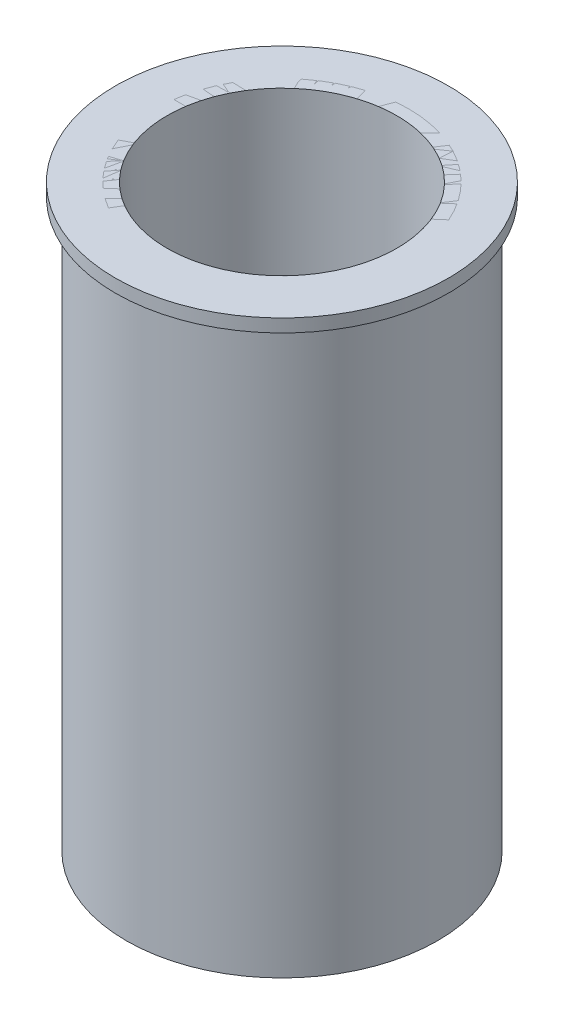
ISO-10303-21;
HEADER;
FILE_DESCRIPTION(('STEP AP214'),'2;1');
FILE_NAME('part.step','',(''),(''),'','','');
FILE_SCHEMA(('AUTOMOTIVE_DESIGN { 1 0 10303 214 1 1 1 1 }'));
ENDSEC;
DATA;
#1=APPLICATION_CONTEXT('core data for automotive mechanical design processes');
#2=APPLICATION_PROTOCOL_DEFINITION('international standard','automotive_design',2000,#1);
#3=PRODUCT_CONTEXT('',#1,'mechanical');
#4=PRODUCT('Part','Part','',(#3));
#5=PRODUCT_RELATED_PRODUCT_CATEGORY('part','',(#4));
#6=PRODUCT_DEFINITION_FORMATION('','',#4);
#7=PRODUCT_DEFINITION_CONTEXT('part definition',#1,'design');
#8=PRODUCT_DEFINITION('design','',#6,#7);
#9=PRODUCT_DEFINITION_SHAPE('','',#8);
#10=(LENGTH_UNIT() NAMED_UNIT(*) SI_UNIT(.MILLI.,.METRE.));
#11=(NAMED_UNIT(*) PLANE_ANGLE_UNIT() SI_UNIT($,.RADIAN.));
#12=(NAMED_UNIT(*) SI_UNIT($,.STERADIAN.) SOLID_ANGLE_UNIT());
#13=UNCERTAINTY_MEASURE_WITH_UNIT(LENGTH_MEASURE(1.E-05),#10,'distance_accuracy_value','');
#14=(GEOMETRIC_REPRESENTATION_CONTEXT(3) GLOBAL_UNCERTAINTY_ASSIGNED_CONTEXT((#13)) GLOBAL_UNIT_ASSIGNED_CONTEXT((#10,
#11,#12)) REPRESENTATION_CONTEXT('',''));
#15=CARTESIAN_POINT('',(0.,0.,0.));
#16=DIRECTION('',(0.,0.,1.));
#17=DIRECTION('',(1.,0.,0.));
#18=AXIS2_PLACEMENT_3D('',#15,#16,#17);
#19=CARTESIAN_POINT('',(0.,-15.64,0.));
#20=DIRECTION('',(0.,-1.,0.));
#21=DIRECTION('',(0.,0.,-1.));
#22=AXIS2_PLACEMENT_3D('',#19,#20,#21);
#23=CYLINDRICAL_SURFACE('',#22,3.5);
#24=CARTESIAN_POINT('',(0.,0.359999999999999,0.));
#25=DIRECTION('',(0.,-1.,0.));
#26=DIRECTION('',(0.,0.,-1.));
#27=AXIS2_PLACEMENT_3D('',#24,#25,#26);
#28=CIRCLE('',#27,3.5);
#29=CARTESIAN_POINT('',(0.,0.359999999999999,-3.5));
#30=VERTEX_POINT('',#29);
#31=EDGE_CURVE('P0_E21',#30,#30,#28,.T.);
#32=ORIENTED_EDGE('',*,*,#31,.T.);
#33=EDGE_LOOP('',(#32));
#34=FACE_BOUND('',#33,.T.);
#35=CARTESIAN_POINT('',(0.,-15.64,0.));
#36=DIRECTION('',(0.,-1.,0.));
#37=DIRECTION('',(0.,0.,-1.));
#38=AXIS2_PLACEMENT_3D('',#35,#36,#37);
#39=CIRCLE('',#38,3.5);
#40=CARTESIAN_POINT('',(0.,-15.64,-3.5));
#41=VERTEX_POINT('',#40);
#42=EDGE_CURVE('P0_E11',#41,#41,#39,.F.);
#43=ORIENTED_EDGE('',*,*,#42,.T.);
#44=EDGE_LOOP('',(#43));
#45=FACE_BOUND('',#44,.T.);
#46=ADVANCED_FACE('P0_F17',(#34,#45),#23,.T.);
#47=CARTESIAN_POINT('',(0.,0.36,0.));
#48=DIRECTION('',(0.,-1.,0.));
#49=DIRECTION('',(0.,0.,-1.));
#50=AXIS2_PLACEMENT_3D('',#47,#48,#49);
#51=PLANE('',#50);
#52=CARTESIAN_POINT('',(-3.175,0.36,0.));
#53=CARTESIAN_POINT('',(-3.17479759041719,0.36,0.605854694368675));
#54=CARTESIAN_POINT('',(-2.95207785587322,0.36,1.16870070285895));
#55=CARTESIAN_POINT('',(-2.71032567563412,0.36,1.77964454207466));
#56=CARTESIAN_POINT('',(-2.24506403026729,0.36,2.24506403026729));
#57=CARTESIAN_POINT('',(-1.78054744880429,0.36,2.70973820178865));
#58=CARTESIAN_POINT('',(-1.16870070285895,0.36,2.95207785587322));
#59=CARTESIAN_POINT('',(-0.606133925916415,0.36,3.17489874856764));
#60=CARTESIAN_POINT('',(0.,0.36,3.175));
#61=CARTESIAN_POINT('',(0.605087739308986,0.36,3.17510107667248));
#62=CARTESIAN_POINT('',(1.16870070285895,0.36,2.95207785587322));
#63=CARTESIAN_POINT('',(1.77964454207504,0.36,2.71032567563373));
#64=CARTESIAN_POINT('',(2.24506403026729,0.36,2.24506403026729));
#65=CARTESIAN_POINT('',(2.70973820178847,0.36,1.78054744880447));
#66=CARTESIAN_POINT('',(2.95207785587322,0.36,1.16870070285895));
#67=CARTESIAN_POINT('',(3.17479741165207,0.36,0.606389776170601));
#68=CARTESIAN_POINT('',(3.175,0.36,0.));
#69=B_SPLINE_CURVE_WITH_KNOTS('',2,(#52,#53,#54,#55,#56,#57,#58,#59,#60,#61,#62,#63,#64,#65,#66,
#67,#68),.UNSPECIFIED.,.F.,.F.,(3,2,2,2,2,2,2,2,3),(0.,0.125,0.25,0.375,0.5,0.625,0.75,0.875,
1.),.UNSPECIFIED.);
#70=CARTESIAN_POINT('',(-3.175,0.36,0.));
#71=VERTEX_POINT('',#70);
#72=CARTESIAN_POINT('',(3.175,0.36,0.));
#73=VERTEX_POINT('',#72);
#74=EDGE_CURVE('P0_E29',#71,#73,#69,.T.);
#75=ORIENTED_EDGE('',*,*,#74,.F.);
#76=CARTESIAN_POINT('',(3.175,0.36,0.));
#77=CARTESIAN_POINT('',(3.17479759041719,0.36,-0.605854694368675));
#78=CARTESIAN_POINT('',(2.95207785587322,0.36,-1.16870070285895));
#79=CARTESIAN_POINT('',(2.71032567563412,0.36,-1.77964454207466));
#80=CARTESIAN_POINT('',(2.24506403026729,0.36,-2.24506403026729));
#81=CARTESIAN_POINT('',(1.78054744880429,0.36,-2.70973820178865));
#82=CARTESIAN_POINT('',(1.16870070285895,0.36,-2.95207785587322));
#83=CARTESIAN_POINT('',(0.606133925916415,0.36,-3.17489874856764));
#84=CARTESIAN_POINT('',(0.,0.36,-3.175));
#85=CARTESIAN_POINT('',(-0.605087739308986,0.36,-3.17510107667248));
#86=CARTESIAN_POINT('',(-1.16870070285895,0.36,-2.95207785587322));
#87=CARTESIAN_POINT('',(-1.77964454207504,0.36,-2.71032567563373));
#88=CARTESIAN_POINT('',(-2.24506403026729,0.36,-2.24506403026729));
#89=CARTESIAN_POINT('',(-2.70973820178847,0.36,-1.78054744880447));
#90=CARTESIAN_POINT('',(-2.95207785587322,0.36,-1.16870070285895));
#91=CARTESIAN_POINT('',(-3.17479741165207,0.36,-0.606389776170601));
#92=CARTESIAN_POINT('',(-3.175,0.36,0.));
#93=B_SPLINE_CURVE_WITH_KNOTS('',2,(#76,#77,#78,#79,#80,#81,#82,#83,#84,#85,#86,#87,#88,#89,#90,
#91,#92),.UNSPECIFIED.,.F.,.F.,(3,2,2,2,2,2,2,2,3),(0.,0.125,0.25,0.375,0.5,0.625,0.75,0.875,
1.),.UNSPECIFIED.);
#94=EDGE_CURVE('P0_E34',#73,#71,#93,.T.);
#95=ORIENTED_EDGE('',*,*,#94,.F.);
#96=EDGE_LOOP('',(#75,#95));
#97=FACE_BOUND('',#96,.T.);
#98=ORIENTED_EDGE('',*,*,#31,.F.);
#99=EDGE_LOOP('',(#98));
#100=FACE_BOUND('',#99,.T.);
#101=ADVANCED_FACE('P0_F18',(#97,#100),#51,.F.);
#102=OPEN_SHELL('',(#46,#101));
#103=SHELL_BASED_SURFACE_MODEL('P0_B1',(#102));
#104=CARTESIAN_POINT('',(0.,0.36,0.));
#105=DIRECTION('',(0.,1.,0.));
#106=DIRECTION('',(0.,0.,1.));
#107=AXIS2_PLACEMENT_3D('',#104,#105,#106);
#108=PLANE('',#107);
#109=CARTESIAN_POINT('',(0.,0.359999999999999,0.));
#110=DIRECTION('',(0.,1.,0.));
#111=DIRECTION('',(0.,0.,1.));
#112=AXIS2_PLACEMENT_3D('',#109,#110,#111);
#113=CIRCLE('',#112,3.175);
#114=CARTESIAN_POINT('',(0.,0.359999999999999,3.175));
#115=VERTEX_POINT('',#114);
#116=EDGE_CURVE('P1_E18',#115,#115,#113,.F.);
#117=ORIENTED_EDGE('',*,*,#116,.T.);
#118=EDGE_LOOP('',(#117));
#119=FACE_BOUND('',#118,.T.);
#120=CARTESIAN_POINT('',(0.,0.359999999999999,0.));
#121=DIRECTION('',(0.,1.,0.));
#122=DIRECTION('',(0.,0.,1.));
#123=AXIS2_PLACEMENT_3D('',#120,#121,#122);
#124=CIRCLE('',#123,4.6);
#125=CARTESIAN_POINT('',(0.,0.359999999999999,4.6));
#126=VERTEX_POINT('',#125);
#127=EDGE_CURVE('P1_E34',#126,#126,#124,.F.);
#128=ORIENTED_EDGE('',*,*,#127,.F.);
#129=EDGE_LOOP('',(#128));
#130=FACE_BOUND('',#129,.T.);
#131=ADVANCED_FACE('P1_F15',(#119,#130),#108,.T.);
#132=CARTESIAN_POINT('',(0.,-16.44,0.));
#133=DIRECTION('',(0.,1.,0.));
#134=DIRECTION('',(0.,0.,1.));
#135=AXIS2_PLACEMENT_3D('',#132,#133,#134);
#136=CYLINDRICAL_SURFACE('',#135,3.175);
#137=ORIENTED_EDGE('',*,*,#116,.F.);
#138=EDGE_LOOP('',(#137));
#139=FACE_BOUND('',#138,.T.);
#140=CARTESIAN_POINT('',(0.,-15.64,0.));
#141=DIRECTION('',(0.,1.,0.));
#142=DIRECTION('',(0.,0.,1.));
#143=AXIS2_PLACEMENT_3D('',#140,#141,#142);
#144=CIRCLE('',#143,3.175);
#145=CARTESIAN_POINT('',(0.,-15.64,3.175));
#146=VERTEX_POINT('',#145);
#147=EDGE_CURVE('P1_E32',#146,#146,#144,.F.);
#148=ORIENTED_EDGE('',*,*,#147,.T.);
#149=EDGE_LOOP('',(#148));
#150=FACE_BOUND('',#149,.T.);
#151=ADVANCED_FACE('P1_F43',(#139,#150),#136,.F.);
#152=CARTESIAN_POINT('',(0.,-16.44,0.));
#153=DIRECTION('',(0.,1.,0.));
#154=DIRECTION('',(0.,0.,1.));
#155=AXIS2_PLACEMENT_3D('',#152,#153,#154);
#156=CYLINDRICAL_SURFACE('',#155,4.6);
#157=ORIENTED_EDGE('',*,*,#127,.T.);
#158=EDGE_LOOP('',(#157));
#159=FACE_BOUND('',#158,.T.);
#160=CARTESIAN_POINT('',(0.,0.,0.));
#161=DIRECTION('',(0.,1.,0.));
#162=DIRECTION('',(0.,0.,1.));
#163=AXIS2_PLACEMENT_3D('',#160,#161,#162);
#164=CIRCLE('',#163,4.6);
#165=CARTESIAN_POINT('',(0.,0.,4.6));
#166=VERTEX_POINT('',#165);
#167=EDGE_CURVE('P1_E27',#166,#166,#164,.T.);
#168=ORIENTED_EDGE('',*,*,#167,.T.);
#169=EDGE_LOOP('',(#168));
#170=FACE_BOUND('',#169,.T.);
#171=ADVANCED_FACE('P1_F46',(#159,#170),#156,.T.);
#172=CARTESIAN_POINT('',(0.,-15.64,0.));
#173=DIRECTION('',(0.,1.,0.));
#174=DIRECTION('',(0.,0.,1.));
#175=AXIS2_PLACEMENT_3D('',#172,#173,#174);
#176=PLANE('',#175);
#177=ORIENTED_EDGE('',*,*,#147,.F.);
#178=EDGE_LOOP('',(#177));
#179=FACE_BOUND('',#178,.T.);
#180=CARTESIAN_POINT('',(0.,-15.64,0.));
#181=DIRECTION('',(0.,1.,0.));
#182=DIRECTION('',(0.,0.,1.));
#183=AXIS2_PLACEMENT_3D('',#180,#181,#182);
#184=CIRCLE('',#183,4.3);
#185=CARTESIAN_POINT('',(0.,-15.64,4.3));
#186=VERTEX_POINT('',#185);
#187=EDGE_CURVE('P1_E22',#186,#186,#184,.T.);
#188=ORIENTED_EDGE('',*,*,#187,.F.);
#189=EDGE_LOOP('',(#188));
#190=FACE_BOUND('',#189,.T.);
#191=ADVANCED_FACE('P1_F49',(#179,#190),#176,.F.);
#192=CARTESIAN_POINT('',(0.,0.,0.));
#193=DIRECTION('',(0.,1.,0.));
#194=DIRECTION('',(0.,0.,1.));
#195=AXIS2_PLACEMENT_3D('',#192,#193,#194);
#196=PLANE('',#195);
#197=CARTESIAN_POINT('',(0.,0.,0.));
#198=DIRECTION('',(0.,1.,0.));
#199=DIRECTION('',(0.,0.,1.));
#200=AXIS2_PLACEMENT_3D('',#197,#198,#199);
#201=CIRCLE('',#200,4.3);
#202=CARTESIAN_POINT('',(0.,0.,4.3));
#203=VERTEX_POINT('',#202);
#204=EDGE_CURVE('P1_E10',#203,#203,#201,.F.);
#205=ORIENTED_EDGE('',*,*,#204,.F.);
#206=EDGE_LOOP('',(#205));
#207=FACE_BOUND('',#206,.T.);
#208=ORIENTED_EDGE('',*,*,#167,.F.);
#209=EDGE_LOOP('',(#208));
#210=FACE_BOUND('',#209,.T.);
#211=ADVANCED_FACE('P1_F52',(#207,#210),#196,.F.);
#212=CARTESIAN_POINT('',(0.,-16.44,0.));
#213=DIRECTION('',(0.,1.,0.));
#214=DIRECTION('',(0.,0.,1.));
#215=AXIS2_PLACEMENT_3D('',#212,#213,#214);
#216=CYLINDRICAL_SURFACE('',#215,4.3);
#217=ORIENTED_EDGE('',*,*,#204,.T.);
#218=EDGE_LOOP('',(#217));
#219=FACE_BOUND('',#218,.T.);
#220=ORIENTED_EDGE('',*,*,#187,.T.);
#221=EDGE_LOOP('',(#220));
#222=FACE_BOUND('',#221,.T.);
#223=ADVANCED_FACE('P1_F56',(#219,#222),#216,.T.);
#224=CLOSED_SHELL('',(#131,#151,#171,#191,#211,#223));
#225=MANIFOLD_SOLID_BREP('P1_B1',#224);
#226=ADVANCED_BREP_SHAPE_REPRESENTATION('',(#18,#225),#14);
#227=MANIFOLD_SURFACE_SHAPE_REPRESENTATION('',(#18,#103),#14);
#228=SHAPE_REPRESENTATION('',(#18),#14);
#229=SHAPE_DEFINITION_REPRESENTATION(#9,#228);
#230=SHAPE_REPRESENTATION_RELATIONSHIP('','',#228,#226);
#231=SHAPE_REPRESENTATION_RELATIONSHIP('','',#228,#227);
ENDSEC;
END-ISO-10303-21;
